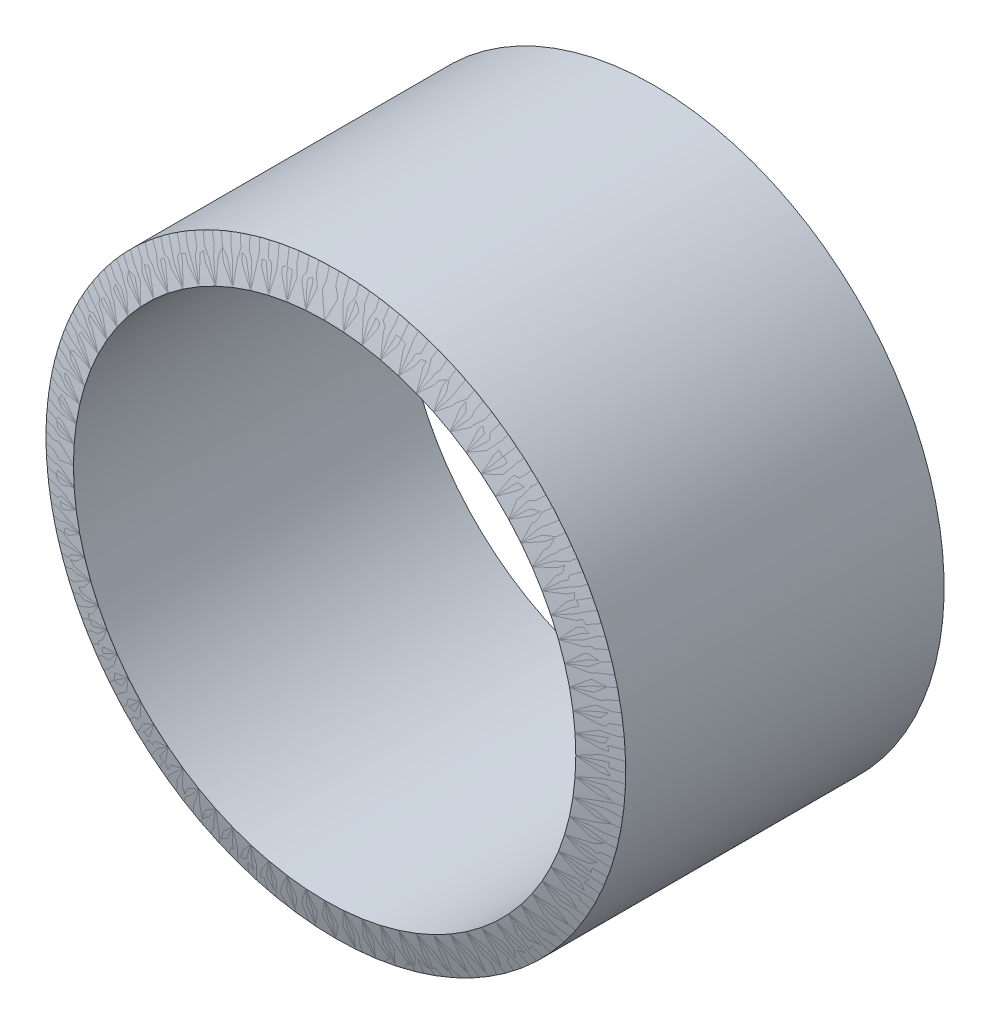
ISO-10303-21;
HEADER;
FILE_DESCRIPTION(('STEP AP214'),'2;1');
FILE_NAME('part.step','',(''),(''),'','','');
FILE_SCHEMA(('AUTOMOTIVE_DESIGN { 1 0 10303 214 1 1 1 1 }'));
ENDSEC;
DATA;
#1=APPLICATION_CONTEXT('core data for automotive mechanical design processes');
#2=APPLICATION_PROTOCOL_DEFINITION('international standard','automotive_design',2000,#1);
#3=PRODUCT_CONTEXT('',#1,'mechanical');
#4=PRODUCT('Part','Part','',(#3));
#5=PRODUCT_RELATED_PRODUCT_CATEGORY('part','',(#4));
#6=PRODUCT_DEFINITION_FORMATION('','',#4);
#7=PRODUCT_DEFINITION_CONTEXT('part definition',#1,'design');
#8=PRODUCT_DEFINITION('design','',#6,#7);
#9=PRODUCT_DEFINITION_SHAPE('','',#8);
#10=(LENGTH_UNIT() NAMED_UNIT(*) SI_UNIT(.MILLI.,.METRE.));
#11=(NAMED_UNIT(*) PLANE_ANGLE_UNIT() SI_UNIT($,.RADIAN.));
#12=(NAMED_UNIT(*) SI_UNIT($,.STERADIAN.) SOLID_ANGLE_UNIT());
#13=UNCERTAINTY_MEASURE_WITH_UNIT(LENGTH_MEASURE(1.E-05),#10,'distance_accuracy_value','');
#14=(GEOMETRIC_REPRESENTATION_CONTEXT(3) GLOBAL_UNCERTAINTY_ASSIGNED_CONTEXT((#13)) GLOBAL_UNIT_ASSIGNED_CONTEXT((#10,
#11,#12)) REPRESENTATION_CONTEXT('',''));
#15=CARTESIAN_POINT('',(0.,0.,0.));
#16=DIRECTION('',(0.,0.,1.));
#17=DIRECTION('',(1.,0.,0.));
#18=AXIS2_PLACEMENT_3D('',#15,#16,#17);
#19=CARTESIAN_POINT('',(0.,0.,-31.18));
#20=DIRECTION('',(0.,0.,1.));
#21=DIRECTION('',(0.,1.,0.));
#22=AXIS2_PLACEMENT_3D('',#19,#20,#21);
#23=SPHERICAL_SURFACE('',#22,50.04);
#24=CARTESIAN_POINT('',(0.,0.,17.1418542690572));
#25=DIRECTION('',(0.,0.,-1.));
#26=DIRECTION('',(-1.,0.,0.));
#27=AXIS2_PLACEMENT_3D('',#24,#25,#26);
#28=CIRCLE('',#27,13.);
#29=CARTESIAN_POINT('',(-13.,0.,17.1418542690572));
#30=VERTEX_POINT('',#29);
#31=EDGE_CURVE('E84',#30,#30,#28,.F.);
#32=ORIENTED_EDGE('',*,*,#31,.F.);
#33=EDGE_LOOP('',(#32));
#34=FACE_BOUND('',#33,.T.);
#35=CARTESIAN_POINT('',(0.,0.,16.5588898069488));
#36=DIRECTION('',(0.,0.,-1.));
#37=DIRECTION('',(0.,1.,0.));
#38=AXIS2_PLACEMENT_3D('',#35,#36,#37);
#39=CIRCLE('',#38,15.);
#40=CARTESIAN_POINT('',(0.,-15.,16.5588898069488));
#41=VERTEX_POINT('',#40);
#42=EDGE_CURVE('E75',#41,#41,#39,.T.);
#43=ORIENTED_EDGE('',*,*,#42,.F.);
#44=EDGE_LOOP('',(#43));
#45=FACE_BOUND('',#44,.T.);
#46=ADVANCED_FACE('F65',(#34,#45),#23,.T.);
#47=CARTESIAN_POINT('',(0.,0.,-31.19));
#48=DIRECTION('',(0.,0.,1.));
#49=DIRECTION('',(0.,1.,0.));
#50=AXIS2_PLACEMENT_3D('',#47,#48,#49);
#51=SPHERICAL_SURFACE('',#50,50.04);
#52=CARTESIAN_POINT('',(0.,0.,17.1318542690572));
#53=DIRECTION('',(0.,0.,-1.));
#54=DIRECTION('',(-1.,0.,0.));
#55=AXIS2_PLACEMENT_3D('',#52,#53,#54);
#56=CIRCLE('',#55,13.);
#57=CARTESIAN_POINT('',(-13.,0.,17.1318542690572));
#58=VERTEX_POINT('',#57);
#59=EDGE_CURVE('E69',#58,#58,#56,.F.);
#60=ORIENTED_EDGE('',*,*,#59,.T.);
#61=EDGE_LOOP('',(#60));
#62=FACE_BOUND('',#61,.T.);
#63=CARTESIAN_POINT('',(0.,0.,16.5488898069488));
#64=DIRECTION('',(0.,0.,1.));
#65=DIRECTION('',(0.,1.,0.));
#66=AXIS2_PLACEMENT_3D('',#63,#64,#65);
#67=CIRCLE('',#66,15.);
#68=CARTESIAN_POINT('',(0.,-15.,16.5488898069488));
#69=VERTEX_POINT('',#68);
#70=EDGE_CURVE('E12',#69,#69,#67,.T.);
#71=ORIENTED_EDGE('',*,*,#70,.F.);
#72=EDGE_LOOP('',(#71));
#73=FACE_BOUND('',#72,.T.);
#74=ADVANCED_FACE('F93',(#62,#73),#51,.F.);
#75=CARTESIAN_POINT('',(0.,0.,18.9779250378736));
#76=DIRECTION('',(0.,0.,-1.));
#77=DIRECTION('',(0.,1.,0.));
#78=AXIS2_PLACEMENT_3D('',#75,#76,#77);
#79=CYLINDRICAL_SURFACE('',#78,15.);
#80=ORIENTED_EDGE('',*,*,#70,.T.);
#81=EDGE_LOOP('',(#80));
#82=FACE_BOUND('',#81,.T.);
#83=ORIENTED_EDGE('',*,*,#42,.T.);
#84=EDGE_LOOP('',(#83));
#85=FACE_BOUND('',#84,.T.);
#86=ADVANCED_FACE('F67',(#82,#85),#79,.T.);
#87=CARTESIAN_POINT('',(0.,0.,-0.249849878134083));
#88=DIRECTION('',(0.,0.,1.));
#89=DIRECTION('',(1.,0.,0.));
#90=AXIS2_PLACEMENT_3D('',#87,#88,#89);
#91=CYLINDRICAL_SURFACE('',#90,13.);
#92=ORIENTED_EDGE('',*,*,#31,.T.);
#93=EDGE_LOOP('',(#92));
#94=FACE_BOUND('',#93,.T.);
#95=ORIENTED_EDGE('',*,*,#59,.F.);
#96=EDGE_LOOP('',(#95));
#97=FACE_BOUND('',#96,.T.);
#98=ADVANCED_FACE('F96',(#94,#97),#91,.F.);
#99=CLOSED_SHELL('',(#46,#74,#86,#98));
#100=MANIFOLD_SOLID_BREP('B2',#99);
#101=CARTESIAN_POINT('',(0.,0.,0.01));
#102=CARTESIAN_POINT('',(0.,0.15625,0.01));
#103=CARTESIAN_POINT('',(0.,0.3125,0.0101178464893273));
#104=CARTESIAN_POINT('',(0.,0.625,0.0105881761362593));
#105=CARTESIAN_POINT('',(0.,0.78125,0.0109406593422417));
#106=CARTESIAN_POINT('',(0.,1.09375,0.0118770928627554));
#107=CARTESIAN_POINT('',(0.,1.25,0.012461043274043));
#108=CARTESIAN_POINT('',(0.,1.5625,0.0138551262200322));
#109=CARTESIAN_POINT('',(0.,1.71875,0.0146652588998699));
#110=CARTESIAN_POINT('',(0.,2.03125,0.0165043023456678));
#111=CARTESIAN_POINT('',(0.,2.1875,0.0175332133051383));
#112=CARTESIAN_POINT('',(0.,2.5,0.0198002851433003));
#113=CARTESIAN_POINT('',(0.,2.65625,0.0210384462638756));
#114=CARTESIAN_POINT('',(0.,2.96875,0.0237123595995446));
#115=CARTESIAN_POINT('',(0.,3.125,0.0251481121049186));
#116=CARTESIAN_POINT('',(0.,3.4375,0.0282034107488315));
#117=CARTESIAN_POINT('',(0.,3.59375,0.0298229572260421));
#118=CARTESIAN_POINT('',(0.,3.90625,0.0332298982861026));
#119=CARTESIAN_POINT('',(0.,4.0625,0.0350172932559821));
#120=CARTESIAN_POINT('',(0.,4.375,0.0387418268273962));
#121=CARTESIAN_POINT('',(0.,4.53125,0.0406789658643028));
#122=CARTESIAN_POINT('',(0.,4.84375,0.0446827118183772));
#123=CARTESIAN_POINT('',(0.,5.,0.0467493192192485));
#124=CARTESIAN_POINT('',(0.,5.3125,0.0509895410906673));
#125=CARTESIAN_POINT('',(0.,5.46875,0.0531631560933221));
#126=CARTESIAN_POINT('',(0.,5.78125,0.0575927320662376));
#127=CARTESIAN_POINT('',(0.,5.9375,0.0598486936169991));
#128=CARTESIAN_POINT('',(0.,6.25,0.0644160846094504));
#129=CARTESIAN_POINT('',(0.,6.40625,0.0667275146800759));
#130=CARTESIAN_POINT('',(0.,6.71875,0.0713767295272565));
#131=CARTESIAN_POINT('',(0.,6.875,0.0737145149811436));
#132=CARTESIAN_POINT('',(0.,7.1875,0.0783850727170537));
#133=CARTESIAN_POINT('',(0.,7.34375,0.0807178457247578));
#134=CARTESIAN_POINT('',(0.,7.65625,0.0853447349626371));
#135=CARTESIAN_POINT('',(0.,7.8125,0.0876388519667704));
#136=CARTESIAN_POINT('',(0.,8.125,0.092152487377777));
#137=CARTESIAN_POINT('',(0.,8.28125,0.0943720066070637));
#138=CARTESIAN_POINT('',(0.,8.59375,0.0986981824981822));
#139=CARTESIAN_POINT('',(0.,8.75,0.100804840030862));
#140=CARTESIAN_POINT('',(0.,9.0625,0.104864681020676));
#141=CARTESIAN_POINT('',(0.,9.21875,0.106817865397192));
#142=CARTESIAN_POINT('',(0.,9.53125,0.110527774191012));
#143=CARTESIAN_POINT('',(0.,9.6875,0.112284499576011));
#144=CARTESIAN_POINT('',(0.,10.,0.115556101838814));
#145=CARTESIAN_POINT('',(0.,10.15625,0.117070979732645));
#146=CARTESIAN_POINT('',(0.,10.46875,0.119811066060996));
#147=CARTESIAN_POINT('',(0.,10.625,0.121036275560045));
#148=CARTESIAN_POINT('',(0.,10.9375,0.123146740553151));
#149=CARTESIAN_POINT('',(0.,11.09375,0.124031997159895));
#150=CARTESIAN_POINT('',(0.,11.40625,0.125409775587888));
#151=CARTESIAN_POINT('',(0.,11.5625,0.125902298570202));
#152=CARTESIAN_POINT('',(0.,11.875,0.126439298642474));
#153=CARTESIAN_POINT('',(0.,12.03125,0.126483776941894));
#154=CARTESIAN_POINT('',(0.,12.34375,0.126066810673258));
#155=CARTESIAN_POINT('',(0.,12.5,0.125605367363015));
#156=CARTESIAN_POINT('',(0.,12.8125,0.124116078038303));
#157=CARTESIAN_POINT('',(0.,12.96875,0.123088233330326));
#158=CARTESIAN_POINT('',(0.,13.28125,0.120403020068389));
#159=CARTESIAN_POINT('',(0.,13.4375,0.11874565286948));
#160=CARTESIAN_POINT('',(0.,13.75,0.114735592285251));
#161=CARTESIAN_POINT('',(0.,13.90625,0.112382900303071));
#162=CARTESIAN_POINT('',(0.,14.21875,0.106913665267733));
#163=CARTESIAN_POINT('',(0.,14.375,0.103797123665886));
#164=CARTESIAN_POINT('',(0.,14.6875,0.0967288991665408));
#165=CARTESIAN_POINT('',(0.,14.84375,0.0927772177685602));
#166=CARTESIAN_POINT('',(0.,15.,0.088370915817466));
#167=(BOUNDED_CURVE() B_SPLINE_CURVE(3,(#101,#102,#103,#104,#105,#106,#107,#108,#109,#110,#111,
#112,#113,#114,#115,#116,#117,#118,#119,#120,#121,#122,#123,#124,#125,#126,#127,#128,#129,#130,
#131,#132,#133,#134,#135,#136,#137,#138,#139,#140,#141,#142,#143,#144,#145,#146,#147,#148,#149,
#150,#151,#152,#153,#154,#155,#156,#157,#158,#159,#160,#161,#162,#163,#164,#165,#166),
.UNSPECIFIED.,.F.,.F.) B_SPLINE_CURVE_WITH_KNOTS((4,2,2,2,2,2,2,2,2,2,2,2,2,2,2,2,2,2,2,2,2,2,2,
2,2,2,2,2,2,2,2,2,4),(0.,0.03125,0.0625,0.09375,0.125,0.15625,0.1875,0.21875,0.25,0.28125,
0.3125,0.34375,0.375,0.40625,0.4375,0.46875,0.5,0.53125,0.5625,0.59375,0.625,0.65625,0.6875,
0.71875,0.75,0.78125,0.8125,0.84375,0.875,0.90625,0.9375,0.96875,1.),
.UNSPECIFIED.) CURVE() GEOMETRIC_REPRESENTATION_ITEM() RATIONAL_B_SPLINE_CURVE((1.,1.,1.,1.,1.,
1.,1.,1.,1.,1.,1.,1.,1.,1.,1.,1.,1.,1.,1.,1.,1.,1.,1.,1.,1.,1.,1.,1.,1.,1.,1.,1.,1.,1.,1.,1.,1.,
1.,1.,1.,1.,1.,1.,1.,1.,1.,1.,1.,1.,1.,1.,1.,1.,1.,1.,1.,1.,1.,1.,1.,1.,1.,1.,1.,1.,1.)) REPRESENTATION_ITEM(''));
#168=CARTESIAN_POINT('',(0.,0.,0.01));
#169=DIRECTION('',(0.,0.,1.));
#170=AXIS1_PLACEMENT('',#168,#169);
#171=SURFACE_OF_REVOLUTION('',#167,#170);
#172=CARTESIAN_POINT('',(0.,0.,0.122753161300606));
#173=DIRECTION('',(0.,0.,1.));
#174=DIRECTION('',(1.,0.,0.));
#175=AXIS2_PLACEMENT_3D('',#172,#173,#174);
#176=CIRCLE('',#175,13.);
#177=CARTESIAN_POINT('',(13.,0.,0.122753161300606));
#178=VERTEX_POINT('',#177);
#179=EDGE_CURVE('E162',#178,#178,#176,.T.);
#180=ORIENTED_EDGE('',*,*,#179,.F.);
#181=EDGE_LOOP('',(#180));
#182=FACE_BOUND('',#181,.T.);
#183=CARTESIAN_POINT('',(0.,0.,0.088370915817466));
#184=DIRECTION('',(0.,0.,1.));
#185=DIRECTION('',(0.,1.,0.));
#186=AXIS2_PLACEMENT_3D('',#183,#184,#185);
#187=CIRCLE('',#186,15.);
#188=CARTESIAN_POINT('',(0.,15.,0.088370915817466));
#189=VERTEX_POINT('',#188);
#190=EDGE_CURVE('E63',#189,#189,#187,.T.);
#191=ORIENTED_EDGE('',*,*,#190,.T.);
#192=EDGE_LOOP('',(#191));
#193=FACE_BOUND('',#192,.T.);
#194=ADVANCED_FACE('F140',(#182,#193),#171,.F.);
#195=CARTESIAN_POINT('',(0.,0.,0.078370915817466));
#196=DIRECTION('',(0.,0.,1.));
#197=DIRECTION('',(0.,1.,0.));
#198=AXIS2_PLACEMENT_3D('',#195,#196,#197);
#199=CYLINDRICAL_SURFACE('',#198,15.);
#200=ORIENTED_EDGE('',*,*,#190,.F.);
#201=EDGE_LOOP('',(#200));
#202=FACE_BOUND('',#201,.T.);
#203=CARTESIAN_POINT('',(0.,0.,0.078370915817466));
#204=DIRECTION('',(0.,0.,1.));
#205=DIRECTION('',(0.,1.,0.));
#206=AXIS2_PLACEMENT_3D('',#203,#204,#205);
#207=CIRCLE('',#206,15.);
#208=CARTESIAN_POINT('',(0.,15.,0.078370915817466));
#209=VERTEX_POINT('',#208);
#210=EDGE_CURVE('E152',#209,#209,#207,.T.);
#211=ORIENTED_EDGE('',*,*,#210,.T.);
#212=EDGE_LOOP('',(#211));
#213=FACE_BOUND('',#212,.T.);
#214=ADVANCED_FACE('F159',(#202,#213),#199,.T.);
#215=CARTESIAN_POINT('',(0.,0.,0.));
#216=CARTESIAN_POINT('',(0.,0.15625,0.));
#217=CARTESIAN_POINT('',(0.,0.3125,0.000117846489327333));
#218=CARTESIAN_POINT('',(0.,0.625,0.000588176136259345));
#219=CARTESIAN_POINT('',(0.,0.78125,0.000940659342241677));
#220=CARTESIAN_POINT('',(0.,1.09375,0.00187709286275539));
#221=CARTESIAN_POINT('',(0.,1.25,0.00246104327404301));
#222=CARTESIAN_POINT('',(0.,1.5625,0.0038551262200322));
#223=CARTESIAN_POINT('',(0.,1.71875,0.00466525889986994));
#224=CARTESIAN_POINT('',(0.,2.03125,0.00650430234566776));
#225=CARTESIAN_POINT('',(0.,2.1875,0.00753321330513825));
#226=CARTESIAN_POINT('',(0.,2.5,0.00980028514330032));
#227=CARTESIAN_POINT('',(0.,2.65625,0.0110384462638756));
#228=CARTESIAN_POINT('',(0.,2.96875,0.0137123595995446));
#229=CARTESIAN_POINT('',(0.,3.125,0.0151481121049186));
#230=CARTESIAN_POINT('',(0.,3.4375,0.0182034107488315));
#231=CARTESIAN_POINT('',(0.,3.59375,0.0198229572260421));
#232=CARTESIAN_POINT('',(0.,3.90625,0.0232298982861026));
#233=CARTESIAN_POINT('',(0.,4.0625,0.0250172932559821));
#234=CARTESIAN_POINT('',(0.,4.375,0.0287418268273962));
#235=CARTESIAN_POINT('',(0.,4.53125,0.0306789658643028));
#236=CARTESIAN_POINT('',(0.,4.84375,0.0346827118183772));
#237=CARTESIAN_POINT('',(0.,5.,0.0367493192192485));
#238=CARTESIAN_POINT('',(0.,5.3125,0.0409895410906673));
#239=CARTESIAN_POINT('',(0.,5.46875,0.0431631560933221));
#240=CARTESIAN_POINT('',(0.,5.78125,0.0475927320662376));
#241=CARTESIAN_POINT('',(0.,5.9375,0.0498486936169991));
#242=CARTESIAN_POINT('',(0.,6.25,0.0544160846094504));
#243=CARTESIAN_POINT('',(0.,6.40625,0.0567275146800759));
#244=CARTESIAN_POINT('',(0.,6.71875,0.0613767295272565));
#245=CARTESIAN_POINT('',(0.,6.875,0.0637145149811436));
#246=CARTESIAN_POINT('',(0.,7.1875,0.0683850727170537));
#247=CARTESIAN_POINT('',(0.,7.34375,0.0707178457247578));
#248=CARTESIAN_POINT('',(0.,7.65625,0.0753447349626371));
#249=CARTESIAN_POINT('',(0.,7.8125,0.0776388519667704));
#250=CARTESIAN_POINT('',(0.,8.125,0.082152487377777));
#251=CARTESIAN_POINT('',(0.,8.28125,0.0843720066070637));
#252=CARTESIAN_POINT('',(0.,8.59375,0.0886981824981822));
#253=CARTESIAN_POINT('',(0.,8.75,0.0908048400308624));
#254=CARTESIAN_POINT('',(0.,9.0625,0.0948646810206756));
#255=CARTESIAN_POINT('',(0.,9.21875,0.0968178653971919));
#256=CARTESIAN_POINT('',(0.,9.53125,0.100527774191012));
#257=CARTESIAN_POINT('',(0.,9.6875,0.102284499576011));
#258=CARTESIAN_POINT('',(0.,10.,0.105556101838814));
#259=CARTESIAN_POINT('',(0.,10.15625,0.107070979732645));
#260=CARTESIAN_POINT('',(0.,10.46875,0.109811066060996));
#261=CARTESIAN_POINT('',(0.,10.625,0.111036275560045));
#262=CARTESIAN_POINT('',(0.,10.9375,0.113146740553151));
#263=CARTESIAN_POINT('',(0.,11.09375,0.114031997159895));
#264=CARTESIAN_POINT('',(0.,11.40625,0.115409775587888));
#265=CARTESIAN_POINT('',(0.,11.5625,0.115902298570202));
#266=CARTESIAN_POINT('',(0.,11.875,0.116439298642474));
#267=CARTESIAN_POINT('',(0.,12.03125,0.116483776941894));
#268=CARTESIAN_POINT('',(0.,12.34375,0.116066810673258));
#269=CARTESIAN_POINT('',(0.,12.5,0.115605367363015));
#270=CARTESIAN_POINT('',(0.,12.8125,0.114116078038303));
#271=CARTESIAN_POINT('',(0.,12.96875,0.113088233330326));
#272=CARTESIAN_POINT('',(0.,13.28125,0.110403020068389));
#273=CARTESIAN_POINT('',(0.,13.4375,0.10874565286948));
#274=CARTESIAN_POINT('',(0.,13.75,0.104735592285251));
#275=CARTESIAN_POINT('',(0.,13.90625,0.102382900303071));
#276=CARTESIAN_POINT('',(0.,14.21875,0.0969136652677335));
#277=CARTESIAN_POINT('',(0.,14.375,0.0937971236658859));
#278=CARTESIAN_POINT('',(0.,14.6875,0.0867288991665408));
#279=CARTESIAN_POINT('',(0.,14.84375,0.0827772177685602));
#280=CARTESIAN_POINT('',(0.,15.,0.078370915817466));
#281=(BOUNDED_CURVE() B_SPLINE_CURVE(3,(#215,#216,#217,#218,#219,#220,#221,#222,#223,#224,#225,
#226,#227,#228,#229,#230,#231,#232,#233,#234,#235,#236,#237,#238,#239,#240,#241,#242,#243,#244,
#245,#246,#247,#248,#249,#250,#251,#252,#253,#254,#255,#256,#257,#258,#259,#260,#261,#262,#263,
#264,#265,#266,#267,#268,#269,#270,#271,#272,#273,#274,#275,#276,#277,#278,#279,#280),
.UNSPECIFIED.,.F.,.F.) B_SPLINE_CURVE_WITH_KNOTS((4,2,2,2,2,2,2,2,2,2,2,2,2,2,2,2,2,2,2,2,2,2,2,
2,2,2,2,2,2,2,2,2,4),(0.,0.03125,0.0625,0.09375,0.125,0.15625,0.1875,0.21875,0.25,0.28125,
0.3125,0.34375,0.375,0.40625,0.4375,0.46875,0.5,0.53125,0.5625,0.59375,0.625,0.65625,0.6875,
0.71875,0.75,0.78125,0.8125,0.84375,0.875,0.90625,0.9375,0.96875,1.),
.UNSPECIFIED.) CURVE() GEOMETRIC_REPRESENTATION_ITEM() RATIONAL_B_SPLINE_CURVE((1.,1.,1.,1.,1.,
1.,1.,1.,1.,1.,1.,1.,1.,1.,1.,1.,1.,1.,1.,1.,1.,1.,1.,1.,1.,1.,1.,1.,1.,1.,1.,1.,1.,1.,1.,1.,1.,
1.,1.,1.,1.,1.,1.,1.,1.,1.,1.,1.,1.,1.,1.,1.,1.,1.,1.,1.,1.,1.,1.,1.,1.,1.,1.,1.,1.,1.)) REPRESENTATION_ITEM(''));
#282=CARTESIAN_POINT('',(0.,0.,0.));
#283=DIRECTION('',(0.,0.,1.));
#284=AXIS1_PLACEMENT('',#282,#283);
#285=SURFACE_OF_REVOLUTION('',#281,#284);
#286=CARTESIAN_POINT('',(0.,0.,0.112753161300606));
#287=DIRECTION('',(0.,0.,1.));
#288=DIRECTION('',(1.,0.,0.));
#289=AXIS2_PLACEMENT_3D('',#286,#287,#288);
#290=CIRCLE('',#289,13.);
#291=CARTESIAN_POINT('',(13.,0.,0.112753161300606));
#292=VERTEX_POINT('',#291);
#293=EDGE_CURVE('E145',#292,#292,#290,.T.);
#294=ORIENTED_EDGE('',*,*,#293,.T.);
#295=EDGE_LOOP('',(#294));
#296=FACE_BOUND('',#295,.T.);
#297=ORIENTED_EDGE('',*,*,#210,.F.);
#298=EDGE_LOOP('',(#297));
#299=FACE_BOUND('',#298,.T.);
#300=ADVANCED_FACE('F142',(#296,#299),#285,.T.);
#301=CARTESIAN_POINT('',(0.,0.,-0.249849878134083));
#302=DIRECTION('',(0.,0.,1.));
#303=DIRECTION('',(1.,0.,0.));
#304=AXIS2_PLACEMENT_3D('',#301,#302,#303);
#305=CYLINDRICAL_SURFACE('',#304,13.);
#306=ORIENTED_EDGE('',*,*,#179,.T.);
#307=EDGE_LOOP('',(#306));
#308=FACE_BOUND('',#307,.T.);
#309=ORIENTED_EDGE('',*,*,#293,.F.);
#310=EDGE_LOOP('',(#309));
#311=FACE_BOUND('',#310,.T.);
#312=ADVANCED_FACE('F184',(#308,#311),#305,.F.);
#313=CLOSED_SHELL('',(#194,#214,#300,#312));
#314=MANIFOLD_SOLID_BREP('B6',#313);
#315=CARTESIAN_POINT('',(0.,0.,-31.18));
#316=DIRECTION('',(0.,0.,1.));
#317=DIRECTION('',(0.,1.,0.));
#318=AXIS2_PLACEMENT_3D('',#315,#316,#317);
#319=SPHERICAL_SURFACE('',#318,50.04);
#320=CARTESIAN_POINT('',(0.,0.,17.1418542690572));
#321=DIRECTION('',(0.,0.,-1.));
#322=DIRECTION('',(-1.,0.,0.));
#323=AXIS2_PLACEMENT_3D('',#320,#321,#322);
#324=CIRCLE('',#323,13.);
#325=CARTESIAN_POINT('',(0.,13.,17.1418542690572));
#326=VERTEX_POINT('',#325);
#327=EDGE_CURVE('E265',#326,#326,#324,.F.);
#328=CARTESIAN_POINT('',(0.,0.,16.5588898069488));
#329=DIRECTION('',(0.,0.,1.));
#330=DIRECTION('',(1.,0.,0.));
#331=AXIS2_PLACEMENT_3D('',#328,#329,#330);
#332=CIRCLE('',#331,15.);
#333=CARTESIAN_POINT('',(0.,15.,16.5588898069488));
#334=VERTEX_POINT('',#333);
#335=EDGE_CURVE('E255',#334,#334,#332,.T.);
#336=CARTESIAN_POINT('',(0.,13.,17.1418542690572));
#337=CARTESIAN_POINT('',(0.,13.0209567369689,17.1362162904596));
#338=CARTESIAN_POINT('',(0.,13.0419098062254,17.130564678734));
#339=CARTESIAN_POINT('',(0.,13.0838085738544,17.1192341986302));
#340=CARTESIAN_POINT('',(0.,13.1047542722268,17.1135553302521));
#341=CARTESIAN_POINT('',(0.,13.1466382626283,17.1021703464466));
#342=CARTESIAN_POINT('',(0.,13.1675765546574,17.0964642310192));
#343=CARTESIAN_POINT('',(0.,13.2094456969289,17.0850247627772));
#344=CARTESIAN_POINT('',(0.,13.2303765471712,17.0792914099625));
#345=CARTESIAN_POINT('',(0.,13.2722307704375,17.0677974766505));
#346=CARTESIAN_POINT('',(0.,13.2931541434614,17.0620368961531));
#347=CARTESIAN_POINT('',(0.,13.3349933768721,17.0504885172274));
#348=CARTESIAN_POINT('',(0.,13.3559092372589,17.044700718799));
#349=CARTESIAN_POINT('',(0.,13.397733409989,17.0330979138086));
#350=CARTESIAN_POINT('',(0.,13.4186417223324,17.0272829072466));
#351=CARTESIAN_POINT('',(0.,13.4604507635826,17.0156256958326));
#352=CARTESIAN_POINT('',(0.,13.4813514924893,17.0097834909806));
#353=CARTESIAN_POINT('',(0.,13.5231453314856,16.9980718928762));
#354=CARTESIAN_POINT('',(0.,13.5440384415752,16.9922024996238));
#355=CARTESIAN_POINT('',(0.,13.5858170075695,16.9804365346543));
#356=CARTESIAN_POINT('',(0.,13.6067024634743,16.9745399629371));
#357=CARTESIAN_POINT('',(0.,13.6484656857444,16.9627196510198));
#358=CARTESIAN_POINT('',(0.,13.6693434521097,16.9567959108195));
#359=CARTESIAN_POINT('',(0.,13.7110912599593,16.9449212719636));
#360=CARTESIAN_POINT('',(0.,13.7319613014436,16.9389703733079));
#361=CARTESIAN_POINT('',(0.,13.7736936242025,16.9270414276146));
#362=CARTESIAN_POINT('',(0.,13.7945559054771,16.9210633805771));
#363=CARTESIAN_POINT('',(0.,13.8362726725014,16.9090801482397));
#364=CARTESIAN_POINT('',(0.,13.857127158251,16.9030749629398));
#365=CARTESIAN_POINT('',(0.,13.8988282989229,16.8910374642434));
#366=CARTESIAN_POINT('',(0.,13.9196749538452,16.8850051508467));
#367=CARTESIAN_POINT('',(0.,13.9613603975736,16.8729134061681));
#368=CARTESIAN_POINT('',(0.,13.9821991863797,16.8668539748861));
#369=CARTESIAN_POINT('',(0.,14.0238688626,16.8547080046941));
#370=CARTESIAN_POINT('',(0.,14.0446997500141,16.8486214657841));
#371=CARTESIAN_POINT('',(0.,14.0863535881883,16.8364212906393));
#372=CARTESIAN_POINT('',(0.,14.1071765389484,16.8303076544045));
#373=CARTESIAN_POINT('',(0.,14.1488144685654,16.8180532949592));
#374=CARTESIAN_POINT('',(0.,14.1696294474224,16.8119125717487));
#375=CARTESIAN_POINT('',(0.,14.211251397998,16.7996040487469));
#376=CARTESIAN_POINT('',(0.,14.2320583697167,16.7934362489556));
#377=CARTESIAN_POINT('',(0.,14.2736642707938,16.781073583233));
#378=CARTESIAN_POINT('',(0.,14.2944632001522,16.7748787173017));
#379=CARTESIAN_POINT('',(0.,14.3360529813009,16.7624619297858));
#380=CARTESIAN_POINT('',(0.,14.356843833091,16.7562400082011));
#381=CARTESIAN_POINT('',(0.,14.3984174239085,16.7437691199108));
#382=CARTESIAN_POINT('',(0.,14.4192001629358,16.7375201532051));
#383=CARTESIAN_POINT('',(0.,14.4607574930468,16.724995185251));
#384=CARTESIAN_POINT('',(0.,14.4815320841304,16.7187191840025));
#385=CARTESIAN_POINT('',(0.,14.5230730831872,16.7061401575866));
#386=CARTESIAN_POINT('',(0.,14.5438394911603,16.6998371324192));
#387=CARTESIAN_POINT('',(0.,14.5853640888428,16.6872040688353));
#388=CARTESIAN_POINT('',(0.,14.6061222785522,16.6808740304187));
#389=CARTESIAN_POINT('',(0.,14.647630404568,16.6681869510518));
#390=CARTESIAN_POINT('',(0.,14.6683803408744,16.6618299101014));
#391=CARTESIAN_POINT('',(0.,14.7098719249591,16.6490888364281));
#392=CARTESIAN_POINT('',(0.,14.7306135727373,16.6427048037051));
#393=CARTESIAN_POINT('',(0.,14.7720885446544,16.6299097572931));
#394=CARTESIAN_POINT('',(0.,14.7928218687932,16.6234987436041));
#395=CARTESIAN_POINT('',(0.,14.8342801583345,16.6106497461134));
#396=CARTESIAN_POINT('',(0.,14.855005123737,16.6042117623116));
#397=CARTESIAN_POINT('',(0.,14.8964466607218,16.5913088354907));
#398=CARTESIAN_POINT('',(0.,14.9171632323041,16.5848438924717));
#399=CARTESIAN_POINT('',(0.,14.9585879465829,16.5718870581698));
#400=CARTESIAN_POINT('',(0.,14.9792960892794,16.5653951668869));
#401=CARTESIAN_POINT('',(0.,15.,16.5588898069488));
#402=B_SPLINE_CURVE_WITH_KNOTS('',3,(#336,#337,#338,#339,#340,#341,#342,#343,#344,#345,#346,
#347,#348,#349,#350,#351,#352,#353,#354,#355,#356,#357,#358,#359,#360,#361,#362,#363,#364,#365,
#366,#367,#368,#369,#370,#371,#372,#373,#374,#375,#376,#377,#378,#379,#380,#381,#382,#383,#384,
#385,#386,#387,#388,#389,#390,#391,#392,#393,#394,#395,#396,#397,#398,#399,#400,#401),
.UNSPECIFIED.,.F.,.F.,(4,2,2,2,2,2,2,2,2,2,2,2,2,2,2,2,2,2,2,2,2,2,2,2,2,2,2,2,2,2,2,2,4),(0.,
0.065105637586335,0.130211275172679,0.195316912759012,0.260422550345357,0.325528187931692,
0.390633825518035,0.45573946310437,0.520845100690715,0.58595073827705,0.651056375863384,
0.716162013449729,0.781267651036061,0.846373288622406,0.911478926208743,0.976584563795086,
1.04169020138142,1.10679583896775,1.1719014765541,1.23700711414043,1.30211275172678,
1.36721838931311,1.43232402689946,1.49742966448579,1.56253530207212,1.62764093965847,
1.69274657724481,1.75785221483115,1.82295785241748,1.88806349000383,1.95316912759016,
2.01827476517651,2.08338040276284),.UNSPECIFIED.);
#403=EDGE_CURVE('BSEAM247',#326,#334,#402,.T.);
#404=ORIENTED_EDGE('',*,*,#327,.F.);
#405=ORIENTED_EDGE('',*,*,#335,.T.);
#406=ORIENTED_EDGE('',*,*,#403,.T.);
#407=ORIENTED_EDGE('',*,*,#403,.F.);
#408=EDGE_LOOP('',(#404,#406,#405,#407));
#409=FACE_BOUND('',#408,.T.);
#410=ADVANCED_FACE('F247',(#409),#319,.T.);
#411=CARTESIAN_POINT('',(0.,0.,0.));
#412=DIRECTION('',(0.,0.,1.));
#413=DIRECTION('',(1.,0.,0.));
#414=AXIS2_PLACEMENT_3D('',#411,#412,#413);
#415=CYLINDRICAL_SURFACE('',#414,15.);
#416=ORIENTED_EDGE('',*,*,#335,.F.);
#417=EDGE_LOOP('',(#416));
#418=FACE_BOUND('',#417,.T.);
#419=CARTESIAN_POINT('',(0.,0.,0.078370915817466));
#420=DIRECTION('',(0.,0.,-1.));
#421=DIRECTION('',(0.,1.,0.));
#422=AXIS2_PLACEMENT_3D('',#419,#420,#421);
#423=CIRCLE('',#422,15.);
#424=CARTESIAN_POINT('',(0.,15.,0.078370915817466));
#425=VERTEX_POINT('',#424);
#426=EDGE_CURVE('E139',#425,#425,#423,.F.);
#427=ORIENTED_EDGE('',*,*,#426,.T.);
#428=EDGE_LOOP('',(#427));
#429=FACE_BOUND('',#428,.T.);
#430=ADVANCED_FACE('F293',(#418,#429),#415,.T.);
#431=CARTESIAN_POINT('',(0.,0.,0.));
#432=CARTESIAN_POINT('',(0.,0.15625,0.));
#433=CARTESIAN_POINT('',(0.,0.3125,0.000117846489327333));
#434=CARTESIAN_POINT('',(0.,0.625,0.000588176136259345));
#435=CARTESIAN_POINT('',(0.,0.78125,0.000940659342241677));
#436=CARTESIAN_POINT('',(0.,1.09375,0.00187709286275539));
#437=CARTESIAN_POINT('',(0.,1.25,0.00246104327404301));
#438=CARTESIAN_POINT('',(0.,1.5625,0.0038551262200322));
#439=CARTESIAN_POINT('',(0.,1.71875,0.00466525889986994));
#440=CARTESIAN_POINT('',(0.,2.03125,0.00650430234566776));
#441=CARTESIAN_POINT('',(0.,2.1875,0.00753321330513825));
#442=CARTESIAN_POINT('',(0.,2.5,0.00980028514330032));
#443=CARTESIAN_POINT('',(0.,2.65625,0.0110384462638756));
#444=CARTESIAN_POINT('',(0.,2.96875,0.0137123595995446));
#445=CARTESIAN_POINT('',(0.,3.125,0.0151481121049186));
#446=CARTESIAN_POINT('',(0.,3.4375,0.0182034107488315));
#447=CARTESIAN_POINT('',(0.,3.59375,0.0198229572260421));
#448=CARTESIAN_POINT('',(0.,3.90625,0.0232298982861026));
#449=CARTESIAN_POINT('',(0.,4.0625,0.0250172932559821));
#450=CARTESIAN_POINT('',(0.,4.375,0.0287418268273962));
#451=CARTESIAN_POINT('',(0.,4.53125,0.0306789658643028));
#452=CARTESIAN_POINT('',(0.,4.84375,0.0346827118183772));
#453=CARTESIAN_POINT('',(0.,5.,0.0367493192192485));
#454=CARTESIAN_POINT('',(0.,5.3125,0.0409895410906673));
#455=CARTESIAN_POINT('',(0.,5.46875,0.0431631560933221));
#456=CARTESIAN_POINT('',(0.,5.78125,0.0475927320662376));
#457=CARTESIAN_POINT('',(0.,5.9375,0.0498486936169991));
#458=CARTESIAN_POINT('',(0.,6.25,0.0544160846094504));
#459=CARTESIAN_POINT('',(0.,6.40625,0.0567275146800759));
#460=CARTESIAN_POINT('',(0.,6.71875,0.0613767295272565));
#461=CARTESIAN_POINT('',(0.,6.875,0.0637145149811436));
#462=CARTESIAN_POINT('',(0.,7.1875,0.0683850727170537));
#463=CARTESIAN_POINT('',(0.,7.34375,0.0707178457247578));
#464=CARTESIAN_POINT('',(0.,7.65625,0.0753447349626371));
#465=CARTESIAN_POINT('',(0.,7.8125,0.0776388519667704));
#466=CARTESIAN_POINT('',(0.,8.125,0.082152487377777));
#467=CARTESIAN_POINT('',(0.,8.28125,0.0843720066070637));
#468=CARTESIAN_POINT('',(0.,8.59375,0.0886981824981822));
#469=CARTESIAN_POINT('',(0.,8.75,0.0908048400308624));
#470=CARTESIAN_POINT('',(0.,9.0625,0.0948646810206756));
#471=CARTESIAN_POINT('',(0.,9.21875,0.0968178653971919));
#472=CARTESIAN_POINT('',(0.,9.53125,0.100527774191012));
#473=CARTESIAN_POINT('',(0.,9.6875,0.102284499576011));
#474=CARTESIAN_POINT('',(0.,10.,0.105556101838814));
#475=CARTESIAN_POINT('',(0.,10.15625,0.107070979732645));
#476=CARTESIAN_POINT('',(0.,10.46875,0.109811066060996));
#477=CARTESIAN_POINT('',(0.,10.625,0.111036275560045));
#478=CARTESIAN_POINT('',(0.,10.9375,0.113146740553151));
#479=CARTESIAN_POINT('',(0.,11.09375,0.114031997159895));
#480=CARTESIAN_POINT('',(0.,11.40625,0.115409775587888));
#481=CARTESIAN_POINT('',(0.,11.5625,0.115902298570202));
#482=CARTESIAN_POINT('',(0.,11.875,0.116439298642474));
#483=CARTESIAN_POINT('',(0.,12.03125,0.116483776941894));
#484=CARTESIAN_POINT('',(0.,12.34375,0.116066810673258));
#485=CARTESIAN_POINT('',(0.,12.5,0.115605367363015));
#486=CARTESIAN_POINT('',(0.,12.8125,0.114116078038303));
#487=CARTESIAN_POINT('',(0.,12.96875,0.113088233330326));
#488=CARTESIAN_POINT('',(0.,13.28125,0.110403020068389));
#489=CARTESIAN_POINT('',(0.,13.4375,0.10874565286948));
#490=CARTESIAN_POINT('',(0.,13.75,0.104735592285251));
#491=CARTESIAN_POINT('',(0.,13.90625,0.102382900303071));
#492=CARTESIAN_POINT('',(0.,14.21875,0.0969136652677335));
#493=CARTESIAN_POINT('',(0.,14.375,0.0937971236658859));
#494=CARTESIAN_POINT('',(0.,14.6875,0.0867288991665408));
#495=CARTESIAN_POINT('',(0.,14.84375,0.0827772177685602));
#496=CARTESIAN_POINT('',(0.,15.,0.078370915817466));
#497=(BOUNDED_CURVE() B_SPLINE_CURVE(3,(#431,#432,#433,#434,#435,#436,#437,#438,#439,#440,#441,
#442,#443,#444,#445,#446,#447,#448,#449,#450,#451,#452,#453,#454,#455,#456,#457,#458,#459,#460,
#461,#462,#463,#464,#465,#466,#467,#468,#469,#470,#471,#472,#473,#474,#475,#476,#477,#478,#479,
#480,#481,#482,#483,#484,#485,#486,#487,#488,#489,#490,#491,#492,#493,#494,#495,#496),
.UNSPECIFIED.,.F.,.F.) B_SPLINE_CURVE_WITH_KNOTS((4,2,2,2,2,2,2,2,2,2,2,2,2,2,2,2,2,2,2,2,2,2,2,
2,2,2,2,2,2,2,2,2,4),(0.,0.03125,0.0625,0.09375,0.125,0.15625,0.1875,0.21875,0.25,0.28125,
0.3125,0.34375,0.375,0.40625,0.4375,0.46875,0.5,0.53125,0.5625,0.59375,0.625,0.65625,0.6875,
0.71875,0.75,0.78125,0.8125,0.84375,0.875,0.90625,0.9375,0.96875,1.),
.UNSPECIFIED.) CURVE() GEOMETRIC_REPRESENTATION_ITEM() RATIONAL_B_SPLINE_CURVE((1.,1.,1.,1.,1.,
1.,1.,1.,1.,1.,1.,1.,1.,1.,1.,1.,1.,1.,1.,1.,1.,1.,1.,1.,1.,1.,1.,1.,1.,1.,1.,1.,1.,1.,1.,1.,1.,
1.,1.,1.,1.,1.,1.,1.,1.,1.,1.,1.,1.,1.,1.,1.,1.,1.,1.,1.,1.,1.,1.,1.,1.,1.,1.,1.,1.,1.)) REPRESENTATION_ITEM(''));
#498=CARTESIAN_POINT('',(0.,0.,0.));
#499=DIRECTION('',(0.,0.,1.));
#500=AXIS1_PLACEMENT('',#498,#499);
#501=SURFACE_OF_REVOLUTION('',#497,#500);
#502=CARTESIAN_POINT('',(0.,0.,0.112753161300606));
#503=DIRECTION('',(0.,0.,1.));
#504=DIRECTION('',(1.,0.,0.));
#505=AXIS2_PLACEMENT_3D('',#502,#503,#504);
#506=CIRCLE('',#505,13.);
#507=CARTESIAN_POINT('',(13.,0.,0.112753161300606));
#508=VERTEX_POINT('',#507);
#509=EDGE_CURVE('E250',#508,#508,#506,.T.);
#510=ORIENTED_EDGE('',*,*,#509,.T.);
#511=EDGE_LOOP('',(#510));
#512=FACE_BOUND('',#511,.T.);
#513=ORIENTED_EDGE('',*,*,#426,.F.);
#514=EDGE_LOOP('',(#513));
#515=FACE_BOUND('',#514,.T.);
#516=ADVANCED_FACE('F283',(#512,#515),#501,.T.);
#517=CARTESIAN_POINT('',(0.,0.,-0.249849878134083));
#518=DIRECTION('',(0.,0.,1.));
#519=DIRECTION('',(1.,0.,0.));
#520=AXIS2_PLACEMENT_3D('',#517,#518,#519);
#521=CYLINDRICAL_SURFACE('',#520,13.);
#522=ORIENTED_EDGE('',*,*,#327,.T.);
#523=EDGE_LOOP('',(#522));
#524=FACE_BOUND('',#523,.T.);
#525=ORIENTED_EDGE('',*,*,#509,.F.);
#526=EDGE_LOOP('',(#525));
#527=FACE_BOUND('',#526,.T.);
#528=ADVANCED_FACE('F292',(#524,#527),#521,.F.);
#529=CLOSED_SHELL('',(#410,#430,#516,#528));
#530=MANIFOLD_SOLID_BREP('B57',#529);
#531=ADVANCED_BREP_SHAPE_REPRESENTATION('',(#18,#100,#314,#530),#14);
#532=SHAPE_DEFINITION_REPRESENTATION(#9,#531);
ENDSEC;
END-ISO-10303-21;
